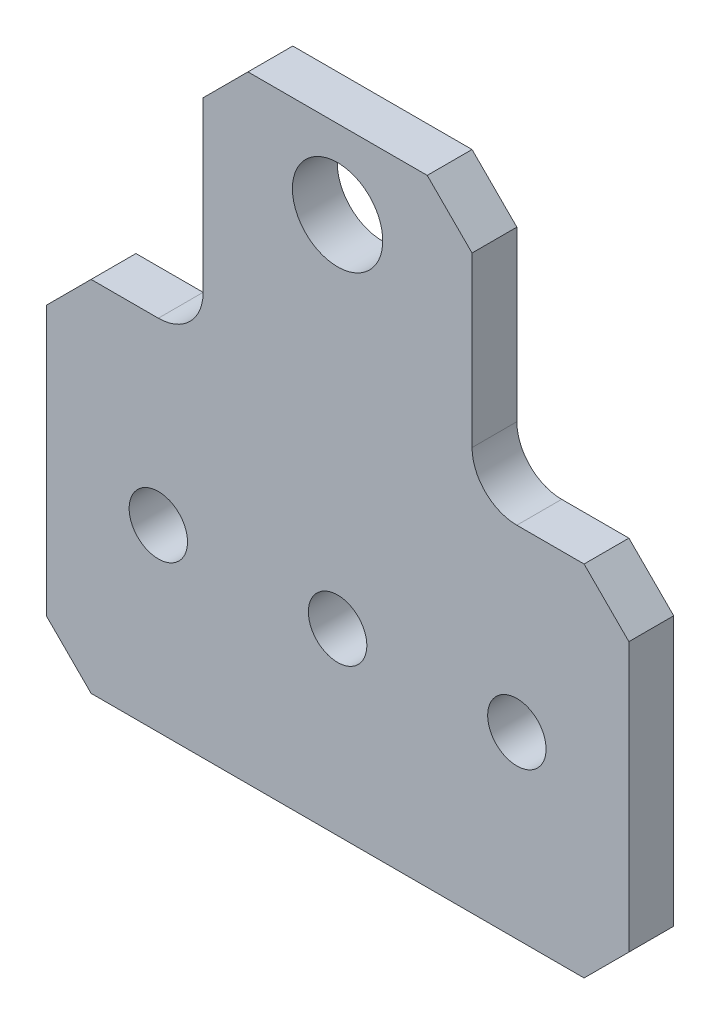
ISO-10303-21;
HEADER;
FILE_DESCRIPTION(('STEP AP214'),'2;1');
FILE_NAME('part.step','',(''),(''),'','','');
FILE_SCHEMA(('AUTOMOTIVE_DESIGN { 1 0 10303 214 1 1 1 1 }'));
ENDSEC;
DATA;
#1=APPLICATION_CONTEXT('core data for automotive mechanical design processes');
#2=APPLICATION_PROTOCOL_DEFINITION('international standard','automotive_design',2000,#1);
#3=PRODUCT_CONTEXT('',#1,'mechanical');
#4=PRODUCT('Part','Part','',(#3));
#5=PRODUCT_RELATED_PRODUCT_CATEGORY('part','',(#4));
#6=PRODUCT_DEFINITION_FORMATION('','',#4);
#7=PRODUCT_DEFINITION_CONTEXT('part definition',#1,'design');
#8=PRODUCT_DEFINITION('design','',#6,#7);
#9=PRODUCT_DEFINITION_SHAPE('','',#8);
#10=(LENGTH_UNIT() NAMED_UNIT(*) SI_UNIT(.MILLI.,.METRE.));
#11=(NAMED_UNIT(*) PLANE_ANGLE_UNIT() SI_UNIT($,.RADIAN.));
#12=(NAMED_UNIT(*) SI_UNIT($,.STERADIAN.) SOLID_ANGLE_UNIT());
#13=UNCERTAINTY_MEASURE_WITH_UNIT(LENGTH_MEASURE(1.E-05),#10,'distance_accuracy_value','');
#14=(GEOMETRIC_REPRESENTATION_CONTEXT(3) GLOBAL_UNCERTAINTY_ASSIGNED_CONTEXT((#13)) GLOBAL_UNIT_ASSIGNED_CONTEXT((#10,
#11,#12)) REPRESENTATION_CONTEXT('',''));
#15=CARTESIAN_POINT('',(0.,0.,0.));
#16=DIRECTION('',(0.,0.,1.));
#17=DIRECTION('',(1.,0.,0.));
#18=AXIS2_PLACEMENT_3D('',#15,#16,#17);
#19=CARTESIAN_POINT('',(-20.6375,-21.844,3.175));
#20=DIRECTION('',(0.,0.,1.));
#21=DIRECTION('',(1.,0.,0.));
#22=AXIS2_PLACEMENT_3D('',#19,#20,#21);
#23=PLANE('',#22);
#24=DIRECTION('',(1.,0.,0.));
#25=VECTOR('',#24,1.);
#26=CARTESIAN_POINT('',(-20.6375,-21.844,3.175));
#27=LINE('',#26,#25);
#28=CARTESIAN_POINT('',(-17.4625,-21.844,3.175));
#29=VERTEX_POINT('',#28);
#30=CARTESIAN_POINT('',(17.4625,-21.844,3.175));
#31=VERTEX_POINT('',#30);
#32=EDGE_CURVE('E170',#29,#31,#27,.T.);
#33=ORIENTED_EDGE('',*,*,#32,.T.);
#34=DIRECTION('',(-0.707106781186548,-0.707106781186548,0.));
#35=VECTOR('',#34,1.);
#36=CARTESIAN_POINT('',(20.6375,-18.669,3.175));
#37=LINE('',#36,#35);
#38=CARTESIAN_POINT('',(20.6375,-18.669,3.175));
#39=VERTEX_POINT('',#38);
#40=EDGE_CURVE('E165',#31,#39,#37,.F.);
#41=ORIENTED_EDGE('',*,*,#40,.T.);
#42=DIRECTION('',(0.,1.,0.));
#43=VECTOR('',#42,1.);
#44=CARTESIAN_POINT('',(20.6375,21.844,3.175));
#45=LINE('',#44,#43);
#46=CARTESIAN_POINT('',(20.6375,0.381000000000004,3.175));
#47=VERTEX_POINT('',#46);
#48=EDGE_CURVE('E160',#39,#47,#45,.T.);
#49=ORIENTED_EDGE('',*,*,#48,.T.);
#50=DIRECTION('',(0.707106781186548,-0.707106781186547,0.));
#51=VECTOR('',#50,1.);
#52=CARTESIAN_POINT('',(17.4625,3.556,3.175));
#53=LINE('',#52,#51);
#54=CARTESIAN_POINT('',(17.4625,3.556,3.175));
#55=VERTEX_POINT('',#54);
#56=EDGE_CURVE('E141',#47,#55,#53,.F.);
#57=ORIENTED_EDGE('',*,*,#56,.T.);
#58=DIRECTION('',(1.,0.,0.));
#59=VECTOR('',#58,1.);
#60=CARTESIAN_POINT('',(9.525,3.556,3.175));
#61=LINE('',#60,#59);
#62=CARTESIAN_POINT('',(12.7,3.556,3.175));
#63=VERTEX_POINT('',#62);
#64=EDGE_CURVE('E140',#55,#63,#61,.F.);
#65=ORIENTED_EDGE('',*,*,#64,.T.);
#66=CARTESIAN_POINT('',(12.7,6.731,3.175));
#67=DIRECTION('',(0.,0.,1.));
#68=DIRECTION('',(1.,0.,0.));
#69=AXIS2_PLACEMENT_3D('',#66,#67,#68);
#70=CIRCLE('',#69,3.175);
#71=CARTESIAN_POINT('',(9.525,6.731,3.175));
#72=VERTEX_POINT('',#71);
#73=EDGE_CURVE('E128',#63,#72,#70,.F.);
#74=ORIENTED_EDGE('',*,*,#73,.T.);
#75=DIRECTION('',(0.,-1.,0.));
#76=VECTOR('',#75,1.);
#77=CARTESIAN_POINT('',(9.525,18.669,3.175));
#78=LINE('',#77,#76);
#79=CARTESIAN_POINT('',(9.525,18.669,3.175));
#80=VERTEX_POINT('',#79);
#81=EDGE_CURVE('E216',#72,#80,#78,.F.);
#82=ORIENTED_EDGE('',*,*,#81,.T.);
#83=DIRECTION('',(0.707106781186549,-0.707106781186546,0.));
#84=VECTOR('',#83,1.);
#85=CARTESIAN_POINT('',(6.35,21.844,3.175));
#86=LINE('',#85,#84);
#87=CARTESIAN_POINT('',(6.35,21.844,3.175));
#88=VERTEX_POINT('',#87);
#89=EDGE_CURVE('E211',#80,#88,#86,.F.);
#90=ORIENTED_EDGE('',*,*,#89,.T.);
#91=DIRECTION('',(1.,0.,0.));
#92=VECTOR('',#91,1.);
#93=CARTESIAN_POINT('',(-20.6375,21.844,3.175));
#94=LINE('',#93,#92);
#95=CARTESIAN_POINT('',(-6.35,21.844,3.175));
#96=VERTEX_POINT('',#95);
#97=EDGE_CURVE('E206',#88,#96,#94,.F.);
#98=ORIENTED_EDGE('',*,*,#97,.T.);
#99=DIRECTION('',(0.707106781186549,0.707106781186546,0.));
#100=VECTOR('',#99,1.);
#101=CARTESIAN_POINT('',(-6.35,21.844,3.175));
#102=LINE('',#101,#100);
#103=CARTESIAN_POINT('',(-9.525,18.669,3.175));
#104=VERTEX_POINT('',#103);
#105=EDGE_CURVE('E201',#96,#104,#102,.F.);
#106=ORIENTED_EDGE('',*,*,#105,.T.);
#107=DIRECTION('',(0.,1.,0.));
#108=VECTOR('',#107,1.);
#109=CARTESIAN_POINT('',(-9.525,18.669,3.175));
#110=LINE('',#109,#108);
#111=CARTESIAN_POINT('',(-9.525,6.731,3.175));
#112=VERTEX_POINT('',#111);
#113=EDGE_CURVE('E195',#104,#112,#110,.F.);
#114=ORIENTED_EDGE('',*,*,#113,.T.);
#115=CARTESIAN_POINT('',(-12.7,6.731,3.175));
#116=DIRECTION('',(0.,0.,1.));
#117=DIRECTION('',(1.,0.,0.));
#118=AXIS2_PLACEMENT_3D('',#115,#116,#117);
#119=CIRCLE('',#118,3.175);
#120=CARTESIAN_POINT('',(-12.7,3.556,3.175));
#121=VERTEX_POINT('',#120);
#122=EDGE_CURVE('E236',#112,#121,#119,.F.);
#123=ORIENTED_EDGE('',*,*,#122,.T.);
#124=DIRECTION('',(1.,0.,0.));
#125=VECTOR('',#124,1.);
#126=CARTESIAN_POINT('',(-9.525,3.556,3.175));
#127=LINE('',#126,#125);
#128=CARTESIAN_POINT('',(-17.4625,3.556,3.175));
#129=VERTEX_POINT('',#128);
#130=EDGE_CURVE('E190',#121,#129,#127,.F.);
#131=ORIENTED_EDGE('',*,*,#130,.T.);
#132=DIRECTION('',(0.707106781186548,0.707106781186547,0.));
#133=VECTOR('',#132,1.);
#134=CARTESIAN_POINT('',(-20.6375,0.381000000000003,3.175));
#135=LINE('',#134,#133);
#136=CARTESIAN_POINT('',(-20.6375,0.38100000000001,3.175));
#137=VERTEX_POINT('',#136);
#138=EDGE_CURVE('E185',#129,#137,#135,.F.);
#139=ORIENTED_EDGE('',*,*,#138,.T.);
#140=DIRECTION('',(0.,1.,0.));
#141=VECTOR('',#140,1.);
#142=CARTESIAN_POINT('',(-20.6375,21.844,3.175));
#143=LINE('',#142,#141);
#144=CARTESIAN_POINT('',(-20.6375,-18.669,3.175));
#145=VERTEX_POINT('',#144);
#146=EDGE_CURVE('E180',#137,#145,#143,.F.);
#147=ORIENTED_EDGE('',*,*,#146,.T.);
#148=DIRECTION('',(-0.707106781186547,0.707106781186548,0.));
#149=VECTOR('',#148,1.);
#150=CARTESIAN_POINT('',(-17.4625,-21.844,3.175));
#151=LINE('',#150,#149);
#152=EDGE_CURVE('E175',#145,#29,#151,.F.);
#153=ORIENTED_EDGE('',*,*,#152,.T.);
#154=EDGE_LOOP('',(#33,#41,#49,#57,#65,#74,#82,#90,#98,#106,#114,#123,#131,#139,#147,#153));
#155=FACE_BOUND('',#154,.T.);
#156=CARTESIAN_POINT('',(0.,-9.144,3.175));
#157=DIRECTION('',(0.,0.,-1.));
#158=DIRECTION('',(-1.,0.,0.));
#159=AXIS2_PLACEMENT_3D('',#156,#157,#158);
#160=CIRCLE('',#159,2.0701);
#161=CARTESIAN_POINT('',(-2.0701,-9.144,3.175));
#162=VERTEX_POINT('',#161);
#163=EDGE_CURVE('E137',#162,#162,#160,.T.);
#164=ORIENTED_EDGE('',*,*,#163,.T.);
#165=EDGE_LOOP('',(#164));
#166=FACE_BOUND('',#165,.T.);
#167=CARTESIAN_POINT('',(12.7,-9.144,3.175));
#168=DIRECTION('',(0.,0.,-1.));
#169=DIRECTION('',(-1.,0.,0.));
#170=AXIS2_PLACEMENT_3D('',#167,#168,#169);
#171=CIRCLE('',#170,2.0701);
#172=CARTESIAN_POINT('',(10.6299,-9.144,3.175));
#173=VERTEX_POINT('',#172);
#174=EDGE_CURVE('E240',#173,#173,#171,.T.);
#175=ORIENTED_EDGE('',*,*,#174,.T.);
#176=EDGE_LOOP('',(#175));
#177=FACE_BOUND('',#176,.T.);
#178=CARTESIAN_POINT('',(-12.7,-9.144,3.175));
#179=DIRECTION('',(0.,0.,-1.));
#180=DIRECTION('',(-1.,0.,0.));
#181=AXIS2_PLACEMENT_3D('',#178,#179,#180);
#182=CIRCLE('',#181,2.0701);
#183=CARTESIAN_POINT('',(-14.7701,-9.144,3.175));
#184=VERTEX_POINT('',#183);
#185=EDGE_CURVE('E242',#184,#184,#182,.T.);
#186=ORIENTED_EDGE('',*,*,#185,.T.);
#187=EDGE_LOOP('',(#186));
#188=FACE_BOUND('',#187,.T.);
#189=CARTESIAN_POINT('',(0.,16.256,3.175));
#190=DIRECTION('',(0.,0.,-1.));
#191=DIRECTION('',(-1.,0.,0.));
#192=AXIS2_PLACEMENT_3D('',#189,#190,#191);
#193=CIRCLE('',#192,3.2004);
#194=CARTESIAN_POINT('',(-3.2004,16.256,3.175));
#195=VERTEX_POINT('',#194);
#196=EDGE_CURVE('E20',#195,#195,#193,.T.);
#197=ORIENTED_EDGE('',*,*,#196,.T.);
#198=EDGE_LOOP('',(#197));
#199=FACE_BOUND('',#198,.T.);
#200=ADVANCED_FACE('F17',(#155,#166,#177,#188,#199),#23,.T.);
#201=CARTESIAN_POINT('',(0.,16.256,3.175));
#202=DIRECTION('',(0.,0.,-1.));
#203=DIRECTION('',(-1.,0.,0.));
#204=AXIS2_PLACEMENT_3D('',#201,#202,#203);
#205=CYLINDRICAL_SURFACE('',#204,3.2004);
#206=CARTESIAN_POINT('',(0.,16.256,0.));
#207=DIRECTION('',(0.,0.,-1.));
#208=DIRECTION('',(-1.,0.,0.));
#209=AXIS2_PLACEMENT_3D('',#206,#207,#208);
#210=CIRCLE('',#209,3.2004);
#211=CARTESIAN_POINT('',(-3.2004,16.256,0.));
#212=VERTEX_POINT('',#211);
#213=EDGE_CURVE('E145',#212,#212,#210,.T.);
#214=ORIENTED_EDGE('',*,*,#213,.T.);
#215=EDGE_LOOP('',(#214));
#216=FACE_BOUND('',#215,.T.);
#217=ORIENTED_EDGE('',*,*,#196,.F.);
#218=EDGE_LOOP('',(#217));
#219=FACE_BOUND('',#218,.T.);
#220=ADVANCED_FACE('F250',(#216,#219),#205,.F.);
#221=CARTESIAN_POINT('',(-12.7,-9.144,3.175));
#222=DIRECTION('',(0.,0.,-1.));
#223=DIRECTION('',(-1.,0.,0.));
#224=AXIS2_PLACEMENT_3D('',#221,#222,#223);
#225=CYLINDRICAL_SURFACE('',#224,2.0701);
#226=CARTESIAN_POINT('',(-12.7,-9.144,0.));
#227=DIRECTION('',(0.,0.,-1.));
#228=DIRECTION('',(-1.,0.,0.));
#229=AXIS2_PLACEMENT_3D('',#226,#227,#228);
#230=CIRCLE('',#229,2.0701);
#231=CARTESIAN_POINT('',(-14.7701,-9.144,0.));
#232=VERTEX_POINT('',#231);
#233=EDGE_CURVE('E148',#232,#232,#230,.T.);
#234=ORIENTED_EDGE('',*,*,#233,.T.);
#235=EDGE_LOOP('',(#234));
#236=FACE_BOUND('',#235,.T.);
#237=ORIENTED_EDGE('',*,*,#185,.F.);
#238=EDGE_LOOP('',(#237));
#239=FACE_BOUND('',#238,.T.);
#240=ADVANCED_FACE('F252',(#236,#239),#225,.F.);
#241=CARTESIAN_POINT('',(12.7,-9.144,3.175));
#242=DIRECTION('',(0.,0.,-1.));
#243=DIRECTION('',(-1.,0.,0.));
#244=AXIS2_PLACEMENT_3D('',#241,#242,#243);
#245=CYLINDRICAL_SURFACE('',#244,2.0701);
#246=CARTESIAN_POINT('',(12.7,-9.144,0.));
#247=DIRECTION('',(0.,0.,-1.));
#248=DIRECTION('',(-1.,0.,0.));
#249=AXIS2_PLACEMENT_3D('',#246,#247,#248);
#250=CIRCLE('',#249,2.0701);
#251=CARTESIAN_POINT('',(10.6299,-9.144,0.));
#252=VERTEX_POINT('',#251);
#253=EDGE_CURVE('E231',#252,#252,#250,.T.);
#254=ORIENTED_EDGE('',*,*,#253,.T.);
#255=EDGE_LOOP('',(#254));
#256=FACE_BOUND('',#255,.T.);
#257=ORIENTED_EDGE('',*,*,#174,.F.);
#258=EDGE_LOOP('',(#257));
#259=FACE_BOUND('',#258,.T.);
#260=ADVANCED_FACE('F259',(#256,#259),#245,.F.);
#261=CARTESIAN_POINT('',(0.,-9.144,3.175));
#262=DIRECTION('',(0.,0.,-1.));
#263=DIRECTION('',(-1.,0.,0.));
#264=AXIS2_PLACEMENT_3D('',#261,#262,#263);
#265=CYLINDRICAL_SURFACE('',#264,2.0701);
#266=CARTESIAN_POINT('',(0.,-9.144,0.));
#267=DIRECTION('',(0.,0.,-1.));
#268=DIRECTION('',(-1.,0.,0.));
#269=AXIS2_PLACEMENT_3D('',#266,#267,#268);
#270=CIRCLE('',#269,2.0701);
#271=CARTESIAN_POINT('',(-2.0701,-9.144,0.));
#272=VERTEX_POINT('',#271);
#273=EDGE_CURVE('E228',#272,#272,#270,.T.);
#274=ORIENTED_EDGE('',*,*,#273,.T.);
#275=EDGE_LOOP('',(#274));
#276=FACE_BOUND('',#275,.T.);
#277=ORIENTED_EDGE('',*,*,#163,.F.);
#278=EDGE_LOOP('',(#277));
#279=FACE_BOUND('',#278,.T.);
#280=ADVANCED_FACE('F331',(#276,#279),#265,.F.);
#281=CARTESIAN_POINT('',(12.7,6.731,3.175));
#282=DIRECTION('',(0.,0.,1.));
#283=DIRECTION('',(1.,0.,0.));
#284=AXIS2_PLACEMENT_3D('',#281,#282,#283);
#285=CYLINDRICAL_SURFACE('',#284,3.175);
#286=DIRECTION('',(0.,0.,1.));
#287=VECTOR('',#286,1.);
#288=CARTESIAN_POINT('',(12.7,3.556,3.175));
#289=LINE('',#288,#287);
#290=CARTESIAN_POINT('',(12.7,3.556,0.));
#291=VERTEX_POINT('',#290);
#292=EDGE_CURVE('E132',#63,#291,#289,.F.);
#293=ORIENTED_EDGE('',*,*,#292,.T.);
#294=CARTESIAN_POINT('',(12.7,6.731,0.));
#295=DIRECTION('',(0.,0.,1.));
#296=DIRECTION('',(1.,0.,0.));
#297=AXIS2_PLACEMENT_3D('',#294,#295,#296);
#298=CIRCLE('',#297,3.175);
#299=CARTESIAN_POINT('',(9.525,6.731,0.));
#300=VERTEX_POINT('',#299);
#301=EDGE_CURVE('E225',#291,#300,#298,.F.);
#302=ORIENTED_EDGE('',*,*,#301,.T.);
#303=DIRECTION('',(0.,0.,1.));
#304=VECTOR('',#303,1.);
#305=CARTESIAN_POINT('',(9.525,6.731,3.175));
#306=LINE('',#305,#304);
#307=EDGE_CURVE('E133',#300,#72,#306,.T.);
#308=ORIENTED_EDGE('',*,*,#307,.T.);
#309=ORIENTED_EDGE('',*,*,#73,.F.);
#310=EDGE_LOOP('',(#293,#302,#308,#309));
#311=FACE_BOUND('',#310,.T.);
#312=ADVANCED_FACE('F130',(#311),#285,.F.);
#313=CARTESIAN_POINT('',(9.525,18.669,3.175));
#314=DIRECTION('',(-1.,0.,0.));
#315=DIRECTION('',(0.,-1.,0.));
#316=AXIS2_PLACEMENT_3D('',#313,#314,#315);
#317=PLANE('',#316);
#318=ORIENTED_EDGE('',*,*,#307,.F.);
#319=DIRECTION('',(0.,1.,0.));
#320=VECTOR('',#319,1.);
#321=CARTESIAN_POINT('',(9.525,-21.844,0.));
#322=LINE('',#321,#320);
#323=CARTESIAN_POINT('',(9.525,18.669,0.));
#324=VERTEX_POINT('',#323);
#325=EDGE_CURVE('E227',#300,#324,#322,.T.);
#326=ORIENTED_EDGE('',*,*,#325,.T.);
#327=DIRECTION('',(0.,0.,1.));
#328=VECTOR('',#327,1.);
#329=CARTESIAN_POINT('',(9.525,18.669,3.175));
#330=LINE('',#329,#328);
#331=EDGE_CURVE('E213',#324,#80,#330,.T.);
#332=ORIENTED_EDGE('',*,*,#331,.T.);
#333=ORIENTED_EDGE('',*,*,#81,.F.);
#334=EDGE_LOOP('',(#318,#326,#332,#333));
#335=FACE_BOUND('',#334,.T.);
#336=ADVANCED_FACE('F324',(#335),#317,.F.);
#337=CARTESIAN_POINT('',(6.35,21.844,3.175));
#338=DIRECTION('',(-0.707106781186546,-0.707106781186549,0.));
#339=DIRECTION('',(0.707106781186549,-0.707106781186546,0.));
#340=AXIS2_PLACEMENT_3D('',#337,#338,#339);
#341=PLANE('',#340);
#342=ORIENTED_EDGE('',*,*,#89,.F.);
#343=ORIENTED_EDGE('',*,*,#331,.F.);
#344=DIRECTION('',(-0.707106781186549,0.707106781186546,0.));
#345=VECTOR('',#344,1.);
#346=CARTESIAN_POINT('',(9.525,18.669,0.));
#347=LINE('',#346,#345);
#348=CARTESIAN_POINT('',(6.35,21.844,0.));
#349=VERTEX_POINT('',#348);
#350=EDGE_CURVE('E491',#324,#349,#347,.T.);
#351=ORIENTED_EDGE('',*,*,#350,.T.);
#352=DIRECTION('',(0.,0.,-1.));
#353=VECTOR('',#352,1.);
#354=CARTESIAN_POINT('',(6.35,21.844,3.175));
#355=LINE('',#354,#353);
#356=EDGE_CURVE('E208',#349,#88,#355,.F.);
#357=ORIENTED_EDGE('',*,*,#356,.T.);
#358=EDGE_LOOP('',(#342,#343,#351,#357));
#359=FACE_BOUND('',#358,.T.);
#360=ADVANCED_FACE('F320',(#359),#341,.F.);
#361=CARTESIAN_POINT('',(-20.6375,21.844,3.175));
#362=DIRECTION('',(0.,-1.,0.));
#363=DIRECTION('',(0.,0.,-1.));
#364=AXIS2_PLACEMENT_3D('',#361,#362,#363);
#365=PLANE('',#364);
#366=ORIENTED_EDGE('',*,*,#97,.F.);
#367=ORIENTED_EDGE('',*,*,#356,.F.);
#368=DIRECTION('',(1.,0.,0.));
#369=VECTOR('',#368,1.);
#370=CARTESIAN_POINT('',(-20.6375,21.844,0.));
#371=LINE('',#370,#369);
#372=CARTESIAN_POINT('',(-6.35,21.844,0.));
#373=VERTEX_POINT('',#372);
#374=EDGE_CURVE('E493',#349,#373,#371,.F.);
#375=ORIENTED_EDGE('',*,*,#374,.T.);
#376=DIRECTION('',(0.,0.,1.));
#377=VECTOR('',#376,1.);
#378=CARTESIAN_POINT('',(-6.35,21.844,3.175));
#379=LINE('',#378,#377);
#380=EDGE_CURVE('E203',#373,#96,#379,.T.);
#381=ORIENTED_EDGE('',*,*,#380,.T.);
#382=EDGE_LOOP('',(#366,#367,#375,#381));
#383=FACE_BOUND('',#382,.T.);
#384=ADVANCED_FACE('F316',(#383),#365,.F.);
#385=CARTESIAN_POINT('',(-6.35,21.844,3.175));
#386=DIRECTION('',(0.707106781186546,-0.707106781186549,0.));
#387=DIRECTION('',(0.707106781186549,0.707106781186546,0.));
#388=AXIS2_PLACEMENT_3D('',#385,#386,#387);
#389=PLANE('',#388);
#390=ORIENTED_EDGE('',*,*,#380,.F.);
#391=DIRECTION('',(-0.707106781186549,-0.707106781186547,0.));
#392=VECTOR('',#391,1.);
#393=CARTESIAN_POINT('',(-6.35,21.844,0.));
#394=LINE('',#393,#392);
#395=CARTESIAN_POINT('',(-9.525,18.669,0.));
#396=VERTEX_POINT('',#395);
#397=EDGE_CURVE('E573',#373,#396,#394,.T.);
#398=ORIENTED_EDGE('',*,*,#397,.T.);
#399=DIRECTION('',(0.,0.,1.));
#400=VECTOR('',#399,1.);
#401=CARTESIAN_POINT('',(-9.525,18.669,3.175));
#402=LINE('',#401,#400);
#403=EDGE_CURVE('E198',#396,#104,#402,.T.);
#404=ORIENTED_EDGE('',*,*,#403,.T.);
#405=ORIENTED_EDGE('',*,*,#105,.F.);
#406=EDGE_LOOP('',(#390,#398,#404,#405));
#407=FACE_BOUND('',#406,.T.);
#408=ADVANCED_FACE('F312',(#407),#389,.F.);
#409=CARTESIAN_POINT('',(-9.525,18.669,3.175));
#410=DIRECTION('',(1.,0.,0.));
#411=DIRECTION('',(0.,1.,0.));
#412=AXIS2_PLACEMENT_3D('',#409,#410,#411);
#413=PLANE('',#412);
#414=DIRECTION('',(0.,0.,1.));
#415=VECTOR('',#414,1.);
#416=CARTESIAN_POINT('',(-9.525,6.731,3.175));
#417=LINE('',#416,#415);
#418=CARTESIAN_POINT('',(-9.525,6.731,0.));
#419=VERTEX_POINT('',#418);
#420=EDGE_CURVE('E197',#419,#112,#417,.T.);
#421=ORIENTED_EDGE('',*,*,#420,.T.);
#422=ORIENTED_EDGE('',*,*,#113,.F.);
#423=ORIENTED_EDGE('',*,*,#403,.F.);
#424=DIRECTION('',(0.,1.,0.));
#425=VECTOR('',#424,1.);
#426=CARTESIAN_POINT('',(-9.525,-21.844,0.));
#427=LINE('',#426,#425);
#428=EDGE_CURVE('E224',#396,#419,#427,.F.);
#429=ORIENTED_EDGE('',*,*,#428,.T.);
#430=EDGE_LOOP('',(#421,#422,#423,#429));
#431=FACE_BOUND('',#430,.T.);
#432=ADVANCED_FACE('F308',(#431),#413,.F.);
#433=CARTESIAN_POINT('',(-12.7,6.731,3.175));
#434=DIRECTION('',(0.,0.,1.));
#435=DIRECTION('',(1.,0.,0.));
#436=AXIS2_PLACEMENT_3D('',#433,#434,#435);
#437=CYLINDRICAL_SURFACE('',#436,3.175);
#438=ORIENTED_EDGE('',*,*,#420,.F.);
#439=CARTESIAN_POINT('',(-12.7,6.731,0.));
#440=DIRECTION('',(0.,0.,1.));
#441=DIRECTION('',(1.,0.,0.));
#442=AXIS2_PLACEMENT_3D('',#439,#440,#441);
#443=CIRCLE('',#442,3.175);
#444=CARTESIAN_POINT('',(-12.7,3.556,0.));
#445=VERTEX_POINT('',#444);
#446=EDGE_CURVE('E220',#419,#445,#443,.F.);
#447=ORIENTED_EDGE('',*,*,#446,.T.);
#448=DIRECTION('',(0.,0.,1.));
#449=VECTOR('',#448,1.);
#450=CARTESIAN_POINT('',(-12.7,3.556,3.175));
#451=LINE('',#450,#449);
#452=EDGE_CURVE('E192',#445,#121,#451,.T.);
#453=ORIENTED_EDGE('',*,*,#452,.T.);
#454=ORIENTED_EDGE('',*,*,#122,.F.);
#455=EDGE_LOOP('',(#438,#447,#453,#454));
#456=FACE_BOUND('',#455,.T.);
#457=ADVANCED_FACE('F304',(#456),#437,.F.);
#458=CARTESIAN_POINT('',(-9.525,3.556,3.175));
#459=DIRECTION('',(0.,-1.,0.));
#460=DIRECTION('',(1.,0.,0.));
#461=AXIS2_PLACEMENT_3D('',#458,#459,#460);
#462=PLANE('',#461);
#463=DIRECTION('',(0.,0.,1.));
#464=VECTOR('',#463,1.);
#465=CARTESIAN_POINT('',(-17.4625,3.556,3.175));
#466=LINE('',#465,#464);
#467=CARTESIAN_POINT('',(-17.4625,3.556,0.));
#468=VERTEX_POINT('',#467);
#469=EDGE_CURVE('E187',#468,#129,#466,.T.);
#470=ORIENTED_EDGE('',*,*,#469,.T.);
#471=ORIENTED_EDGE('',*,*,#130,.F.);
#472=ORIENTED_EDGE('',*,*,#452,.F.);
#473=DIRECTION('',(1.,0.,0.));
#474=VECTOR('',#473,1.);
#475=CARTESIAN_POINT('',(-20.6375,3.556,0.));
#476=LINE('',#475,#474);
#477=EDGE_CURVE('E223',#445,#468,#476,.F.);
#478=ORIENTED_EDGE('',*,*,#477,.T.);
#479=EDGE_LOOP('',(#470,#471,#472,#478));
#480=FACE_BOUND('',#479,.T.);
#481=ADVANCED_FACE('F300',(#480),#462,.F.);
#482=CARTESIAN_POINT('',(-20.6375,0.381000000000003,3.175));
#483=DIRECTION('',(0.707106781186547,-0.707106781186548,0.));
#484=DIRECTION('',(0.707106781186548,0.707106781186547,0.));
#485=AXIS2_PLACEMENT_3D('',#482,#483,#484);
#486=PLANE('',#485);
#487=ORIENTED_EDGE('',*,*,#469,.F.);
#488=DIRECTION('',(-0.707106781186548,-0.707106781186547,0.));
#489=VECTOR('',#488,1.);
#490=CARTESIAN_POINT('',(-17.4625,3.556,0.));
#491=LINE('',#490,#489);
#492=CARTESIAN_POINT('',(-20.6375,0.381000000000008,0.));
#493=VERTEX_POINT('',#492);
#494=EDGE_CURVE('E550',#468,#493,#491,.T.);
#495=ORIENTED_EDGE('',*,*,#494,.T.);
#496=DIRECTION('',(0.,0.,-1.));
#497=VECTOR('',#496,1.);
#498=CARTESIAN_POINT('',(-20.6375,0.38100000000001,3.175));
#499=LINE('',#498,#497);
#500=EDGE_CURVE('E182',#493,#137,#499,.F.);
#501=ORIENTED_EDGE('',*,*,#500,.T.);
#502=ORIENTED_EDGE('',*,*,#138,.F.);
#503=EDGE_LOOP('',(#487,#495,#501,#502));
#504=FACE_BOUND('',#503,.T.);
#505=ADVANCED_FACE('F296',(#504),#486,.F.);
#506=CARTESIAN_POINT('',(-20.6375,21.844,3.175));
#507=DIRECTION('',(1.,0.,0.));
#508=DIRECTION('',(0.,0.,-1.));
#509=AXIS2_PLACEMENT_3D('',#506,#507,#508);
#510=PLANE('',#509);
#511=DIRECTION('',(0.,0.,1.));
#512=VECTOR('',#511,1.);
#513=CARTESIAN_POINT('',(-20.6375,-18.669,3.175));
#514=LINE('',#513,#512);
#515=CARTESIAN_POINT('',(-20.6375,-18.669,0.));
#516=VERTEX_POINT('',#515);
#517=EDGE_CURVE('E177',#516,#145,#514,.T.);
#518=ORIENTED_EDGE('',*,*,#517,.T.);
#519=ORIENTED_EDGE('',*,*,#146,.F.);
#520=ORIENTED_EDGE('',*,*,#500,.F.);
#521=DIRECTION('',(0.,1.,0.));
#522=VECTOR('',#521,1.);
#523=CARTESIAN_POINT('',(-20.6375,-21.844,0.));
#524=LINE('',#523,#522);
#525=EDGE_CURVE('E541',#493,#516,#524,.F.);
#526=ORIENTED_EDGE('',*,*,#525,.T.);
#527=EDGE_LOOP('',(#518,#519,#520,#526));
#528=FACE_BOUND('',#527,.T.);
#529=ADVANCED_FACE('F292',(#528),#510,.F.);
#530=CARTESIAN_POINT('',(-17.4625,-21.844,3.175));
#531=DIRECTION('',(0.707106781186548,0.707106781186547,0.));
#532=DIRECTION('',(-0.707106781186547,0.707106781186548,0.));
#533=AXIS2_PLACEMENT_3D('',#530,#531,#532);
#534=PLANE('',#533);
#535=ORIENTED_EDGE('',*,*,#517,.F.);
#536=DIRECTION('',(0.707106781186547,-0.707106781186548,0.));
#537=VECTOR('',#536,1.);
#538=CARTESIAN_POINT('',(-20.6375,-18.669,0.));
#539=LINE('',#538,#537);
#540=CARTESIAN_POINT('',(-17.4625,-21.844,0.));
#541=VERTEX_POINT('',#540);
#542=EDGE_CURVE('E532',#516,#541,#539,.T.);
#543=ORIENTED_EDGE('',*,*,#542,.T.);
#544=DIRECTION('',(0.,0.,1.));
#545=VECTOR('',#544,1.);
#546=CARTESIAN_POINT('',(-17.4625,-21.844,3.175));
#547=LINE('',#546,#545);
#548=EDGE_CURVE('E172',#541,#29,#547,.T.);
#549=ORIENTED_EDGE('',*,*,#548,.T.);
#550=ORIENTED_EDGE('',*,*,#152,.F.);
#551=EDGE_LOOP('',(#535,#543,#549,#550));
#552=FACE_BOUND('',#551,.T.);
#553=ADVANCED_FACE('F288',(#552),#534,.F.);
#554=CARTESIAN_POINT('',(-20.6375,-21.844,3.175));
#555=DIRECTION('',(0.,1.,0.));
#556=DIRECTION('',(0.,0.,1.));
#557=AXIS2_PLACEMENT_3D('',#554,#555,#556);
#558=PLANE('',#557);
#559=DIRECTION('',(0.,0.,1.));
#560=VECTOR('',#559,1.);
#561=CARTESIAN_POINT('',(17.4625,-21.844,3.175));
#562=LINE('',#561,#560);
#563=CARTESIAN_POINT('',(17.4625,-21.844,0.));
#564=VERTEX_POINT('',#563);
#565=EDGE_CURVE('E167',#564,#31,#562,.T.);
#566=ORIENTED_EDGE('',*,*,#565,.T.);
#567=ORIENTED_EDGE('',*,*,#32,.F.);
#568=ORIENTED_EDGE('',*,*,#548,.F.);
#569=DIRECTION('',(1.,0.,0.));
#570=VECTOR('',#569,1.);
#571=CARTESIAN_POINT('',(-20.6375,-21.844,0.));
#572=LINE('',#571,#570);
#573=EDGE_CURVE('E523',#541,#564,#572,.T.);
#574=ORIENTED_EDGE('',*,*,#573,.T.);
#575=EDGE_LOOP('',(#566,#567,#568,#574));
#576=FACE_BOUND('',#575,.T.);
#577=ADVANCED_FACE('F284',(#576),#558,.F.);
#578=CARTESIAN_POINT('',(20.6375,-18.669,3.175));
#579=DIRECTION('',(-0.707106781186548,0.707106781186548,0.));
#580=DIRECTION('',(-0.707106781186548,-0.707106781186548,0.));
#581=AXIS2_PLACEMENT_3D('',#578,#579,#580);
#582=PLANE('',#581);
#583=ORIENTED_EDGE('',*,*,#565,.F.);
#584=DIRECTION('',(0.707106781186547,0.707106781186548,0.));
#585=VECTOR('',#584,1.);
#586=CARTESIAN_POINT('',(17.4625,-21.844,0.));
#587=LINE('',#586,#585);
#588=CARTESIAN_POINT('',(20.6375,-18.669,0.));
#589=VERTEX_POINT('',#588);
#590=EDGE_CURVE('E514',#564,#589,#587,.T.);
#591=ORIENTED_EDGE('',*,*,#590,.T.);
#592=DIRECTION('',(0.,0.,1.));
#593=VECTOR('',#592,1.);
#594=CARTESIAN_POINT('',(20.6375,-18.669,3.175));
#595=LINE('',#594,#593);
#596=EDGE_CURVE('E162',#589,#39,#595,.T.);
#597=ORIENTED_EDGE('',*,*,#596,.T.);
#598=ORIENTED_EDGE('',*,*,#40,.F.);
#599=EDGE_LOOP('',(#583,#591,#597,#598));
#600=FACE_BOUND('',#599,.T.);
#601=ADVANCED_FACE('F280',(#600),#582,.F.);
#602=CARTESIAN_POINT('',(20.6375,21.844,3.175));
#603=DIRECTION('',(-1.,0.,0.));
#604=DIRECTION('',(0.,0.,1.));
#605=AXIS2_PLACEMENT_3D('',#602,#603,#604);
#606=PLANE('',#605);
#607=DIRECTION('',(0.,0.,1.));
#608=VECTOR('',#607,1.);
#609=CARTESIAN_POINT('',(20.6375,0.381000000000002,3.175));
#610=LINE('',#609,#608);
#611=CARTESIAN_POINT('',(20.6375,0.380999999999998,0.));
#612=VERTEX_POINT('',#611);
#613=EDGE_CURVE('E157',#612,#47,#610,.T.);
#614=ORIENTED_EDGE('',*,*,#613,.T.);
#615=ORIENTED_EDGE('',*,*,#48,.F.);
#616=ORIENTED_EDGE('',*,*,#596,.F.);
#617=DIRECTION('',(0.,1.,0.));
#618=VECTOR('',#617,1.);
#619=CARTESIAN_POINT('',(20.6375,-21.844,0.));
#620=LINE('',#619,#618);
#621=EDGE_CURVE('E505',#589,#612,#620,.T.);
#622=ORIENTED_EDGE('',*,*,#621,.T.);
#623=EDGE_LOOP('',(#614,#615,#616,#622));
#624=FACE_BOUND('',#623,.T.);
#625=ADVANCED_FACE('F276',(#624),#606,.F.);
#626=CARTESIAN_POINT('',(17.4625,3.556,3.175));
#627=DIRECTION('',(-0.707106781186547,-0.707106781186548,0.));
#628=DIRECTION('',(0.707106781186548,-0.707106781186547,0.));
#629=AXIS2_PLACEMENT_3D('',#626,#627,#628);
#630=PLANE('',#629);
#631=ORIENTED_EDGE('',*,*,#613,.F.);
#632=DIRECTION('',(-0.707106781186549,0.707106781186546,0.));
#633=VECTOR('',#632,1.);
#634=CARTESIAN_POINT('',(20.6375,0.381000000000003,0.));
#635=LINE('',#634,#633);
#636=CARTESIAN_POINT('',(17.4625,3.556,0.));
#637=VERTEX_POINT('',#636);
#638=EDGE_CURVE('E26',#612,#637,#635,.T.);
#639=ORIENTED_EDGE('',*,*,#638,.T.);
#640=DIRECTION('',(0.,0.,1.));
#641=VECTOR('',#640,1.);
#642=CARTESIAN_POINT('',(17.4625,3.556,3.175));
#643=LINE('',#642,#641);
#644=EDGE_CURVE('E34',#637,#55,#643,.T.);
#645=ORIENTED_EDGE('',*,*,#644,.T.);
#646=ORIENTED_EDGE('',*,*,#56,.F.);
#647=EDGE_LOOP('',(#631,#639,#645,#646));
#648=FACE_BOUND('',#647,.T.);
#649=ADVANCED_FACE('F269',(#648),#630,.F.);
#650=CARTESIAN_POINT('',(9.525,3.556,3.175));
#651=DIRECTION('',(0.,-1.,0.));
#652=DIRECTION('',(1.,0.,0.));
#653=AXIS2_PLACEMENT_3D('',#650,#651,#652);
#654=PLANE('',#653);
#655=ORIENTED_EDGE('',*,*,#644,.F.);
#656=DIRECTION('',(1.,0.,0.));
#657=VECTOR('',#656,1.);
#658=CARTESIAN_POINT('',(-20.6375,3.556,0.));
#659=LINE('',#658,#657);
#660=EDGE_CURVE('E11',#637,#291,#659,.F.);
#661=ORIENTED_EDGE('',*,*,#660,.T.);
#662=ORIENTED_EDGE('',*,*,#292,.F.);
#663=ORIENTED_EDGE('',*,*,#64,.F.);
#664=EDGE_LOOP('',(#655,#661,#662,#663));
#665=FACE_BOUND('',#664,.T.);
#666=ADVANCED_FACE('F139',(#665),#654,.F.);
#667=CARTESIAN_POINT('',(-20.6375,-21.844,0.));
#668=DIRECTION('',(0.,0.,1.));
#669=DIRECTION('',(1.,0.,0.));
#670=AXIS2_PLACEMENT_3D('',#667,#668,#669);
#671=PLANE('',#670);
#672=ORIENTED_EDGE('',*,*,#638,.F.);
#673=ORIENTED_EDGE('',*,*,#621,.F.);
#674=ORIENTED_EDGE('',*,*,#590,.F.);
#675=ORIENTED_EDGE('',*,*,#573,.F.);
#676=ORIENTED_EDGE('',*,*,#542,.F.);
#677=ORIENTED_EDGE('',*,*,#525,.F.);
#678=ORIENTED_EDGE('',*,*,#494,.F.);
#679=ORIENTED_EDGE('',*,*,#477,.F.);
#680=ORIENTED_EDGE('',*,*,#446,.F.);
#681=ORIENTED_EDGE('',*,*,#428,.F.);
#682=ORIENTED_EDGE('',*,*,#397,.F.);
#683=ORIENTED_EDGE('',*,*,#374,.F.);
#684=ORIENTED_EDGE('',*,*,#350,.F.);
#685=ORIENTED_EDGE('',*,*,#325,.F.);
#686=ORIENTED_EDGE('',*,*,#301,.F.);
#687=ORIENTED_EDGE('',*,*,#660,.F.);
#688=EDGE_LOOP('',(#672,#673,#674,#675,#676,#677,#678,#679,#680,#681,#682,#683,#684,#685,#686,#687));
#689=FACE_BOUND('',#688,.T.);
#690=ORIENTED_EDGE('',*,*,#273,.F.);
#691=EDGE_LOOP('',(#690));
#692=FACE_BOUND('',#691,.T.);
#693=ORIENTED_EDGE('',*,*,#253,.F.);
#694=EDGE_LOOP('',(#693));
#695=FACE_BOUND('',#694,.T.);
#696=ORIENTED_EDGE('',*,*,#233,.F.);
#697=EDGE_LOOP('',(#696));
#698=FACE_BOUND('',#697,.T.);
#699=ORIENTED_EDGE('',*,*,#213,.F.);
#700=EDGE_LOOP('',(#699));
#701=FACE_BOUND('',#700,.T.);
#702=ADVANCED_FACE('F262',(#689,#692,#695,#698,#701),#671,.F.);
#703=CLOSED_SHELL('',(#200,#220,#240,#260,#280,#312,#336,#360,#384,#408,#432,#457,#481,#505,
#529,#553,#577,#601,#625,#649,#666,#702));
#704=MANIFOLD_SOLID_BREP('B1',#703);
#705=ADVANCED_BREP_SHAPE_REPRESENTATION('',(#18,#704),#14);
#706=SHAPE_DEFINITION_REPRESENTATION(#9,#705);
ENDSEC;
END-ISO-10303-21;
